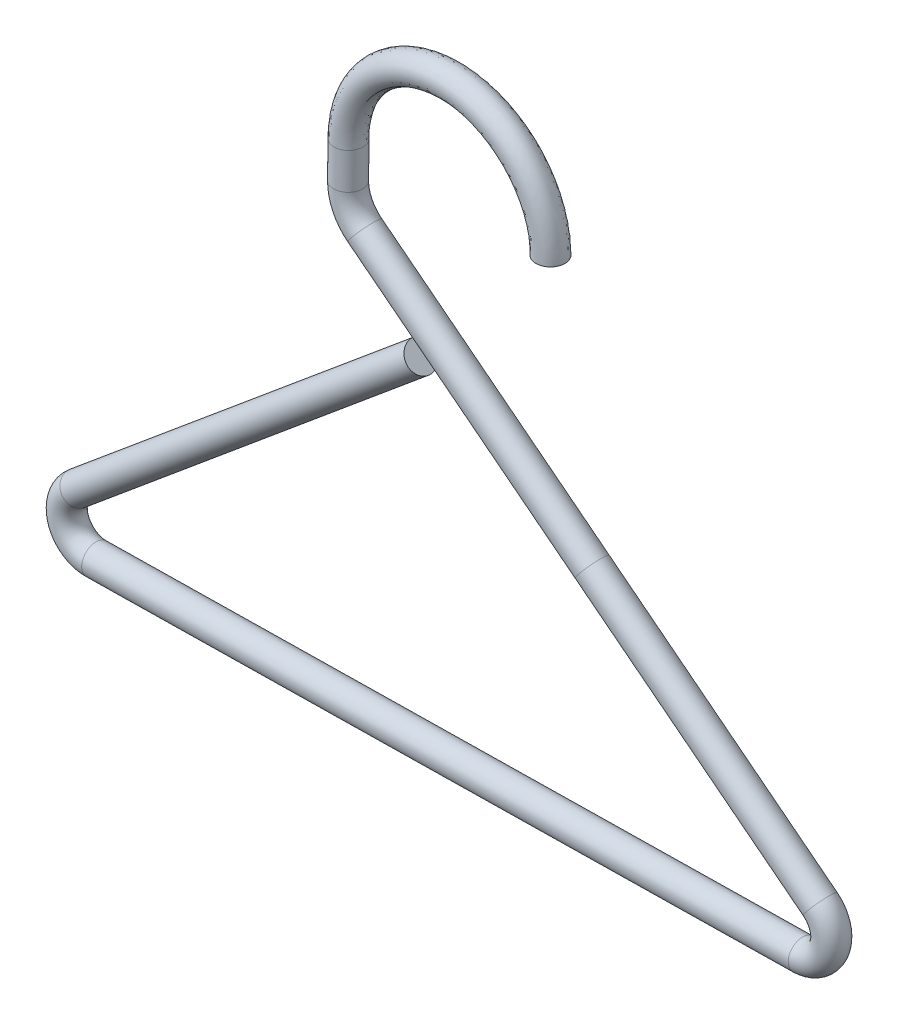
ISO-10303-21;
HEADER;
FILE_DESCRIPTION(('STEP AP214'),'2;1');
FILE_NAME('part.step','',(''),(''),'','','');
FILE_SCHEMA(('AUTOMOTIVE_DESIGN { 1 0 10303 214 1 1 1 1 }'));
ENDSEC;
DATA;
#1=APPLICATION_CONTEXT('core data for automotive mechanical design processes');
#2=APPLICATION_PROTOCOL_DEFINITION('international standard','automotive_design',2000,#1);
#3=PRODUCT_CONTEXT('',#1,'mechanical');
#4=PRODUCT('Part','Part','',(#3));
#5=PRODUCT_RELATED_PRODUCT_CATEGORY('part','',(#4));
#6=PRODUCT_DEFINITION_FORMATION('','',#4);
#7=PRODUCT_DEFINITION_CONTEXT('part definition',#1,'design');
#8=PRODUCT_DEFINITION('design','',#6,#7);
#9=PRODUCT_DEFINITION_SHAPE('','',#8);
#10=(LENGTH_UNIT() NAMED_UNIT(*) SI_UNIT(.MILLI.,.METRE.));
#11=(NAMED_UNIT(*) PLANE_ANGLE_UNIT() SI_UNIT($,.RADIAN.));
#12=(NAMED_UNIT(*) SI_UNIT($,.STERADIAN.) SOLID_ANGLE_UNIT());
#13=UNCERTAINTY_MEASURE_WITH_UNIT(LENGTH_MEASURE(1.E-05),#10,'distance_accuracy_value','');
#14=(GEOMETRIC_REPRESENTATION_CONTEXT(3) GLOBAL_UNCERTAINTY_ASSIGNED_CONTEXT((#13)) GLOBAL_UNIT_ASSIGNED_CONTEXT((#10,
#11,#12)) REPRESENTATION_CONTEXT('',''));
#15=CARTESIAN_POINT('',(0.,0.,0.));
#16=DIRECTION('',(0.,0.,1.));
#17=DIRECTION('',(1.,0.,0.));
#18=AXIS2_PLACEMENT_3D('',#15,#16,#17);
#19=CARTESIAN_POINT('',(34.7848708234437,166.880762929068,0.));
#20=DIRECTION('',(0.,1.,0.));
#21=DIRECTION('',(-1.,0.,0.));
#22=AXIS2_PLACEMENT_3D('',#19,#20,#21);
#23=PLANE('',#22);
#24=CARTESIAN_POINT('',(34.7848708234437,166.880762929068,0.));
#25=DIRECTION('',(0.,1.,0.));
#26=DIRECTION('',(-1.,0.,0.));
#27=AXIS2_PLACEMENT_3D('',#24,#25,#26);
#28=CIRCLE('',#27,5.);
#29=CARTESIAN_POINT('',(29.7848708234437,166.880762929068,0.));
#30=VERTEX_POINT('',#29);
#31=EDGE_CURVE('E60',#30,#30,#28,.T.);
#32=ORIENTED_EDGE('',*,*,#31,.F.);
#33=EDGE_LOOP('',(#32));
#34=FACE_BOUND('',#33,.T.);
#35=ADVANCED_FACE('F57',(#34),#23,.F.);
#36=CARTESIAN_POINT('',(-9.75362425147519,114.481574235297,0.));
#37=DIRECTION('',(0.768326622468667,0.640057967066961,0.));
#38=DIRECTION('',(-0.640057967066961,0.768326622468667,0.));
#39=AXIS2_PLACEMENT_3D('',#36,#37,#38);
#40=PLANE('',#39);
#41=CARTESIAN_POINT('',(-9.75362425147519,114.481574235297,0.));
#42=DIRECTION('',(0.768326622468667,0.640057967066961,0.));
#43=DIRECTION('',(-0.640057967066961,0.768326622468667,0.));
#44=AXIS2_PLACEMENT_3D('',#41,#42,#43);
#45=CIRCLE('',#44,5.);
#46=CARTESIAN_POINT('',(-12.95391408681,118.32320734764,0.));
#47=VERTEX_POINT('',#46);
#48=EDGE_CURVE('E162',#47,#47,#45,.T.);
#49=ORIENTED_EDGE('',*,*,#48,.T.);
#50=EDGE_LOOP('',(#49));
#51=FACE_BOUND('',#50,.T.);
#52=ADVANCED_FACE('F109',(#51),#40,.T.);
#53=CARTESIAN_POINT('',(-29.7848708234437,166.680762929068,0.));
#54=CARTESIAN_POINT('',(-29.7848708234437,166.747429595733,0.));
#55=CARTESIAN_POINT('',(-29.7848712337079,166.818887619035,0.));
#56=CARTESIAN_POINT('',(-29.7848690718144,167.14494052602,0.));
#57=CARTESIAN_POINT('',(-29.7818792644815,167.368193226743,0.));
#58=CARTESIAN_POINT('',(-29.7699160847641,167.855451148638,0.));
#59=CARTESIAN_POINT('',(-29.760944454568,168.098999599399,0.));
#60=CARTESIAN_POINT('',(-29.7250684327807,168.829192658391,0.));
#61=CARTESIAN_POINT('',(-29.6892011832558,169.315385671612,0.));
#62=CARTESIAN_POINT('',(-29.5458803039341,170.770439824601,0.));
#63=CARTESIAN_POINT('',(-29.4026774218284,171.735776002078,0.));
#64=CARTESIAN_POINT('',(-28.8321824746925,174.603717666936,0.));
#65=CARTESIAN_POINT('',(-28.2636414200745,176.477914753748,0.));
#66=CARTESIAN_POINT('',(-26.0256147566677,181.880989077507,0.));
#67=CARTESIAN_POINT('',(-23.8179735227869,185.184957678453,0.));
#68=CARTESIAN_POINT('',(-18.3041947492579,190.698736451729,0.));
#69=CARTESIAN_POINT('',(-15.0002261703578,192.906377676608,0.));
#70=CARTESIAN_POINT('',(-7.7961270281747,195.890413246073,0.));
#71=CARTESIAN_POINT('',(-3.89883036083754,196.665633752449,0.));
#72=CARTESIAN_POINT('',(3.89883036083754,196.665633752575,0.));
#73=CARTESIAN_POINT('',(7.79612702821601,195.890413246145,0.));
#74=CARTESIAN_POINT('',(15.0002261703164,192.906377676536,0.));
#75=CARTESIAN_POINT('',(18.3041947492454,190.698736451931,0.));
#76=CARTESIAN_POINT('',(23.8179735227994,185.184957678251,0.));
#77=CARTESIAN_POINT('',(26.0256147566305,181.880989077584,0.));
#78=CARTESIAN_POINT('',(29.009650307914,174.676889979085,0.));
#79=CARTESIAN_POINT('',(29.7848708234358,170.780296352017,0.));
#80=CARTESIAN_POINT('',(29.7848708234437,166.880762929068,0.));
#81=CARTESIAN_POINT('',(-29.7848708234437,166.680762929068,9.99999999999999));
#82=CARTESIAN_POINT('',(-29.7848708234437,166.747429595733,9.99999999999999));
#83=CARTESIAN_POINT('',(-29.7848712337079,166.818887619035,9.99999999999999));
#84=CARTESIAN_POINT('',(-29.7848690718144,167.14494052602,9.99999999999999));
#85=CARTESIAN_POINT('',(-29.7818792644815,167.368193226743,9.99999999999999));
#86=CARTESIAN_POINT('',(-29.7699160847641,167.855451148638,9.99999999999999));
#87=CARTESIAN_POINT('',(-29.760944454568,168.098999599399,9.99999999999999));
#88=CARTESIAN_POINT('',(-29.7250684327807,168.829192658391,9.99999999999999));
#89=CARTESIAN_POINT('',(-29.6892011832558,169.315385671612,9.99999999999999));
#90=CARTESIAN_POINT('',(-29.5458803039341,170.770439824601,9.99999999999999));
#91=CARTESIAN_POINT('',(-29.4026774218284,171.735776002078,9.99999999999999));
#92=CARTESIAN_POINT('',(-28.8321824746925,174.603717666936,9.99999999999999));
#93=CARTESIAN_POINT('',(-28.2636414200745,176.477914753748,9.99999999999999));
#94=CARTESIAN_POINT('',(-26.0256147566677,181.880989077507,9.99999999999999));
#95=CARTESIAN_POINT('',(-23.8179735227869,185.184957678453,9.99999999999999));
#96=CARTESIAN_POINT('',(-18.3041947492579,190.698736451729,9.99999999999999));
#97=CARTESIAN_POINT('',(-15.0002261703578,192.906377676609,9.99999999999999));
#98=CARTESIAN_POINT('',(-7.7961270281747,195.890413246073,9.99999999999999));
#99=CARTESIAN_POINT('',(-3.89883036083754,196.665633752449,9.99999999999999));
#100=CARTESIAN_POINT('',(3.89883036083754,196.665633752575,9.99999999999999));
#101=CARTESIAN_POINT('',(7.79612702821601,195.890413246145,9.99999999999999));
#102=CARTESIAN_POINT('',(15.0002261703164,192.906377676536,9.99999999999999));
#103=CARTESIAN_POINT('',(18.3041947492454,190.698736451931,9.99999999999999));
#104=CARTESIAN_POINT('',(23.8179735227994,185.184957678251,9.99999999999999));
#105=CARTESIAN_POINT('',(26.0256147566305,181.880989077584,9.99999999999999));
#106=CARTESIAN_POINT('',(29.009650307914,174.676889979085,9.99999999999999));
#107=CARTESIAN_POINT('',(29.7848708234358,170.780296352017,9.99999999999999));
#108=CARTESIAN_POINT('',(29.7848708234437,166.880762929068,9.99999999999999));
#109=CARTESIAN_POINT('',(-39.7848708234437,166.680762929068,9.99999999999999));
#110=CARTESIAN_POINT('',(-39.7848708234437,166.747429595733,9.99999999999999));
#111=CARTESIAN_POINT('',(-39.7848713714504,166.809304909456,9.99999999999999));
#112=CARTESIAN_POINT('',(-39.7848684837202,167.185854053364,9.99999999999999));
#113=CARTESIAN_POINT('',(-39.7808748757155,167.531843524427,9.99999999999999));
#114=CARTESIAN_POINT('',(-39.7648951670085,168.182693870404,9.99999999999999));
#115=CARTESIAN_POINT('',(-39.7529113934152,168.508011502639,9.99999999999999));
#116=CARTESIAN_POINT('',(-39.7049903229852,169.483360252699,9.99999999999999));
#117=CARTESIAN_POINT('',(-39.6570809700247,170.13278815658,9.99999999999999));
#118=CARTESIAN_POINT('',(-39.4656414065018,172.076363532837,9.99999999999999));
#119=CARTESIAN_POINT('',(-39.274359456674,173.365802568857,9.99999999999999));
#120=CARTESIAN_POINT('',(-38.5123260098656,177.196629613275,9.99999999999999));
#121=CARTESIAN_POINT('',(-37.7529024572065,179.70007135853,9.99999999999999));
#122=CARTESIAN_POINT('',(-34.7634786577422,186.917178838896,9.99999999999999));
#123=CARTESIAN_POINT('',(-31.814641919999,191.330424904971,9.99999999999999));
#124=CARTESIAN_POINT('',(-24.4496619757766,198.695404848941,9.99999999999999));
#125=CARTESIAN_POINT('',(-20.0364159391368,201.644241574683,9.99999999999999));
#126=CARTESIAN_POINT('',(-10.4136059066975,205.630139998224,9.99999999999999));
#127=CARTESIAN_POINT('',(-5.20782726193153,206.665633752449,9.99999999999999));
#128=CARTESIAN_POINT('',(5.20782726193153,206.665633752575,9.99999999999999));
#129=CARTESIAN_POINT('',(10.4136059067315,205.630139998236,9.99999999999999));
#130=CARTESIAN_POINT('',(20.0364159391028,201.644241574671,9.99999999999999));
#131=CARTESIAN_POINT('',(24.4496619757599,198.695404849147,9.99999999999999));
#132=CARTESIAN_POINT('',(31.8146419200158,191.330424904765,9.99999999999999));
#133=CARTESIAN_POINT('',(34.7634786577031,186.917178838977,9.99999999999999));
#134=CARTESIAN_POINT('',(38.7493770570671,177.294368864994,9.99999999999999));
#135=CARTESIAN_POINT('',(39.7848708233963,172.089529299981,9.99999999999999));
#136=CARTESIAN_POINT('',(39.7848708234437,166.880762929068,9.99999999999999));
#137=CARTESIAN_POINT('',(-39.7848708234437,166.680762929068,0.));
#138=CARTESIAN_POINT('',(-39.7848708234437,166.747429595733,0.));
#139=CARTESIAN_POINT('',(-39.7848713714504,166.809304909456,0.));
#140=CARTESIAN_POINT('',(-39.7848684837202,167.185854053364,0.));
#141=CARTESIAN_POINT('',(-39.7808748757155,167.531843524427,0.));
#142=CARTESIAN_POINT('',(-39.7648951670085,168.182693870404,0.));
#143=CARTESIAN_POINT('',(-39.7529113934152,168.508011502639,0.));
#144=CARTESIAN_POINT('',(-39.7049903229852,169.483360252699,0.));
#145=CARTESIAN_POINT('',(-39.6570809700247,170.13278815658,0.));
#146=CARTESIAN_POINT('',(-39.4656414065018,172.076363532837,0.));
#147=CARTESIAN_POINT('',(-39.274359456674,173.365802568857,0.));
#148=CARTESIAN_POINT('',(-38.5123260098656,177.196629613275,0.));
#149=CARTESIAN_POINT('',(-37.7529024572065,179.70007135853,0.));
#150=CARTESIAN_POINT('',(-34.7634786577422,186.917178838896,0.));
#151=CARTESIAN_POINT('',(-31.814641919999,191.330424904971,0.));
#152=CARTESIAN_POINT('',(-24.4496619757766,198.695404848941,0.));
#153=CARTESIAN_POINT('',(-20.0364159391368,201.644241574683,0.));
#154=CARTESIAN_POINT('',(-10.4136059066975,205.630139998224,0.));
#155=CARTESIAN_POINT('',(-5.20782726193153,206.665633752449,0.));
#156=CARTESIAN_POINT('',(5.20782726193153,206.665633752575,0.));
#157=CARTESIAN_POINT('',(10.4136059067315,205.630139998236,0.));
#158=CARTESIAN_POINT('',(20.0364159391028,201.644241574671,0.));
#159=CARTESIAN_POINT('',(24.4496619757599,198.695404849147,0.));
#160=CARTESIAN_POINT('',(31.8146419200158,191.330424904765,0.));
#161=CARTESIAN_POINT('',(34.7634786577031,186.917178838977,0.));
#162=CARTESIAN_POINT('',(38.7493770570671,177.294368864994,0.));
#163=CARTESIAN_POINT('',(39.7848708233963,172.089529299981,0.));
#164=CARTESIAN_POINT('',(39.7848708234437,166.880762929068,0.));
#165=CARTESIAN_POINT('',(-39.7848708234437,166.680762929068,-9.99999999999999));
#166=CARTESIAN_POINT('',(-39.7848708234437,166.747429595733,-9.99999999999999));
#167=CARTESIAN_POINT('',(-39.7848713714504,166.809304909456,-9.99999999999999));
#168=CARTESIAN_POINT('',(-39.7848684837202,167.185854053364,-9.99999999999999));
#169=CARTESIAN_POINT('',(-39.7808748757155,167.531843524427,-9.99999999999999));
#170=CARTESIAN_POINT('',(-39.7648951670085,168.182693870404,-9.99999999999999));
#171=CARTESIAN_POINT('',(-39.7529113934152,168.508011502639,-9.99999999999999));
#172=CARTESIAN_POINT('',(-39.7049903229852,169.483360252699,-9.99999999999999));
#173=CARTESIAN_POINT('',(-39.6570809700247,170.13278815658,-9.99999999999999));
#174=CARTESIAN_POINT('',(-39.4656414065018,172.076363532837,-9.99999999999999));
#175=CARTESIAN_POINT('',(-39.274359456674,173.365802568857,-9.99999999999999));
#176=CARTESIAN_POINT('',(-38.5123260098656,177.196629613275,-9.99999999999999));
#177=CARTESIAN_POINT('',(-37.7529024572065,179.70007135853,-9.99999999999999));
#178=CARTESIAN_POINT('',(-34.7634786577422,186.917178838896,-9.99999999999999));
#179=CARTESIAN_POINT('',(-31.814641919999,191.330424904971,-9.99999999999999));
#180=CARTESIAN_POINT('',(-24.4496619757766,198.695404848941,-9.99999999999999));
#181=CARTESIAN_POINT('',(-20.0364159391368,201.644241574683,-9.99999999999999));
#182=CARTESIAN_POINT('',(-10.4136059066975,205.630139998224,-9.99999999999999));
#183=CARTESIAN_POINT('',(-5.20782726193153,206.665633752449,-9.99999999999999));
#184=CARTESIAN_POINT('',(5.20782726193153,206.665633752575,-9.99999999999999));
#185=CARTESIAN_POINT('',(10.4136059067315,205.630139998236,-9.99999999999999));
#186=CARTESIAN_POINT('',(20.0364159391028,201.644241574671,-9.99999999999999));
#187=CARTESIAN_POINT('',(24.4496619757599,198.695404849147,-9.99999999999999));
#188=CARTESIAN_POINT('',(31.8146419200158,191.330424904765,-9.99999999999999));
#189=CARTESIAN_POINT('',(34.7634786577031,186.917178838977,-9.99999999999999));
#190=CARTESIAN_POINT('',(38.7493770570671,177.294368864994,-9.99999999999999));
#191=CARTESIAN_POINT('',(39.7848708233963,172.089529299981,-9.99999999999999));
#192=CARTESIAN_POINT('',(39.7848708234437,166.880762929068,-9.99999999999999));
#193=CARTESIAN_POINT('',(-29.7848708234437,166.680762929068,-9.99999999999999));
#194=CARTESIAN_POINT('',(-29.7848708234437,166.747429595733,-9.99999999999999));
#195=CARTESIAN_POINT('',(-29.7848712337079,166.818887619035,-9.99999999999999));
#196=CARTESIAN_POINT('',(-29.7848690718144,167.14494052602,-9.99999999999999));
#197=CARTESIAN_POINT('',(-29.7818792644815,167.368193226743,-9.99999999999999));
#198=CARTESIAN_POINT('',(-29.7699160847641,167.855451148638,-9.99999999999999));
#199=CARTESIAN_POINT('',(-29.760944454568,168.098999599399,-9.99999999999999));
#200=CARTESIAN_POINT('',(-29.7250684327807,168.829192658391,-9.99999999999999));
#201=CARTESIAN_POINT('',(-29.6892011832558,169.315385671612,-9.99999999999999));
#202=CARTESIAN_POINT('',(-29.5458803039341,170.770439824601,-9.99999999999999));
#203=CARTESIAN_POINT('',(-29.4026774218284,171.735776002078,-9.99999999999999));
#204=CARTESIAN_POINT('',(-28.8321824746925,174.603717666936,-9.99999999999999));
#205=CARTESIAN_POINT('',(-28.2636414200745,176.477914753748,-9.99999999999999));
#206=CARTESIAN_POINT('',(-26.0256147566677,181.880989077507,-9.99999999999999));
#207=CARTESIAN_POINT('',(-23.8179735227869,185.184957678453,-9.99999999999999));
#208=CARTESIAN_POINT('',(-18.3041947492579,190.698736451729,-9.99999999999999));
#209=CARTESIAN_POINT('',(-15.0002261703578,192.906377676609,-9.99999999999999));
#210=CARTESIAN_POINT('',(-7.7961270281747,195.890413246073,-9.99999999999999));
#211=CARTESIAN_POINT('',(-3.89883036083754,196.665633752449,-9.99999999999999));
#212=CARTESIAN_POINT('',(3.89883036083754,196.665633752575,-9.99999999999999));
#213=CARTESIAN_POINT('',(7.79612702821601,195.890413246145,-9.99999999999999));
#214=CARTESIAN_POINT('',(15.0002261703164,192.906377676536,-9.99999999999999));
#215=CARTESIAN_POINT('',(18.3041947492454,190.698736451931,-9.99999999999999));
#216=CARTESIAN_POINT('',(23.8179735227994,185.184957678251,-9.99999999999999));
#217=CARTESIAN_POINT('',(26.0256147566305,181.880989077584,-9.99999999999999));
#218=CARTESIAN_POINT('',(29.009650307914,174.676889979085,-9.99999999999999));
#219=CARTESIAN_POINT('',(29.7848708234358,170.780296352017,-9.99999999999999));
#220=CARTESIAN_POINT('',(29.7848708234437,166.880762929068,-9.99999999999999));
#221=CARTESIAN_POINT('',(-29.7848708234437,166.680762929068,0.));
#222=CARTESIAN_POINT('',(-29.7848708234437,166.747429595733,0.));
#223=CARTESIAN_POINT('',(-29.7848712337079,166.818887619035,0.));
#224=CARTESIAN_POINT('',(-29.7848690718144,167.14494052602,0.));
#225=CARTESIAN_POINT('',(-29.7818792644815,167.368193226743,0.));
#226=CARTESIAN_POINT('',(-29.7699160847641,167.855451148638,0.));
#227=CARTESIAN_POINT('',(-29.760944454568,168.098999599399,0.));
#228=CARTESIAN_POINT('',(-29.7250684327807,168.829192658391,0.));
#229=CARTESIAN_POINT('',(-29.6892011832558,169.315385671612,0.));
#230=CARTESIAN_POINT('',(-29.5458803039341,170.770439824601,0.));
#231=CARTESIAN_POINT('',(-29.4026774218284,171.735776002078,0.));
#232=CARTESIAN_POINT('',(-28.8321824746925,174.603717666936,0.));
#233=CARTESIAN_POINT('',(-28.2636414200745,176.477914753748,0.));
#234=CARTESIAN_POINT('',(-26.0256147566677,181.880989077507,0.));
#235=CARTESIAN_POINT('',(-23.8179735227869,185.184957678453,0.));
#236=CARTESIAN_POINT('',(-18.3041947492579,190.698736451729,0.));
#237=CARTESIAN_POINT('',(-15.0002261703578,192.906377676608,0.));
#238=CARTESIAN_POINT('',(-7.7961270281747,195.890413246073,0.));
#239=CARTESIAN_POINT('',(-3.89883036083754,196.665633752449,0.));
#240=CARTESIAN_POINT('',(3.89883036083754,196.665633752575,0.));
#241=CARTESIAN_POINT('',(7.79612702821601,195.890413246145,0.));
#242=CARTESIAN_POINT('',(15.0002261703164,192.906377676536,0.));
#243=CARTESIAN_POINT('',(18.3041947492454,190.698736451931,0.));
#244=CARTESIAN_POINT('',(23.8179735227994,185.184957678251,0.));
#245=CARTESIAN_POINT('',(26.0256147566305,181.880989077584,0.));
#246=CARTESIAN_POINT('',(29.009650307914,174.676889979085,0.));
#247=CARTESIAN_POINT('',(29.7848708234358,170.780296352017,0.));
#248=CARTESIAN_POINT('',(29.7848708234437,166.880762929068,0.));
#249=(BOUNDED_SURFACE() B_SPLINE_SURFACE(3,3,((#53,#54,#55,#56,#57,#58,#59,#60,#61,#62,#63,#64,
#65,#66,#67,#68,#69,#70,#71,#72,#73,#74,#75,#76,#77,#78,#79,#80),(#81,#82,#83,#84,#85,#86,#87,
#88,#89,#90,#91,#92,#93,#94,#95,#96,#97,#98,#99,#100,#101,#102,#103,#104,#105,#106,#107,#108),
(#109,#110,#111,#112,#113,#114,#115,#116,#117,#118,#119,#120,#121,#122,#123,#124,#125,#126,#127,
#128,#129,#130,#131,#132,#133,#134,#135,#136),(#137,#138,#139,#140,#141,#142,#143,#144,#145,
#146,#147,#148,#149,#150,#151,#152,#153,#154,#155,#156,#157,#158,#159,#160,#161,#162,#163,#164),
(#165,#166,#167,#168,#169,#170,#171,#172,#173,#174,#175,#176,#177,#178,#179,#180,#181,#182,#183,
#184,#185,#186,#187,#188,#189,#190,#191,#192),(#193,#194,#195,#196,#197,#198,#199,#200,#201,
#202,#203,#204,#205,#206,#207,#208,#209,#210,#211,#212,#213,#214,#215,#216,#217,#218,#219,#220),
(#221,#222,#223,#224,#225,#226,#227,#228,#229,#230,#231,#232,#233,#234,#235,#236,#237,#238,#239,
#240,#241,#242,#243,#244,#245,#246,#247,#248)),.UNSPECIFIED.,.T.,.F.,
.F.) B_SPLINE_SURFACE_WITH_KNOTS((4,3,4),(4,2,2,2,2,2,2,2,2,2,2,2,2,4),(0.,0.5,1.),
(-0.00182983290487914,0.,0.0078125,0.015625,0.03125,0.0625,0.125,0.25,0.375,0.5,0.625,0.75,
0.875,1.),.UNSPECIFIED.) GEOMETRIC_REPRESENTATION_ITEM() RATIONAL_B_SPLINE_SURFACE(((1.,1.,1.,
1.,1.,1.,1.,1.,1.,1.,1.,1.,1.,1.,1.,1.,1.,1.,1.,1.,1.,1.,1.,1.,1.,1.,1.,1.),(0.333333333333333,
0.333333333333333,0.333333333333333,0.333333333333333,0.333333333333333,0.333333333333333,
0.333333333333333,0.333333333333333,0.333333333333333,0.333333333333333,0.333333333333333,
0.333333333333333,0.333333333333333,0.333333333333333,0.333333333333333,0.333333333333333,
0.333333333333333,0.333333333333333,0.333333333333333,0.333333333333333,0.333333333333333,
0.333333333333333,0.333333333333333,0.333333333333333,0.333333333333333,0.333333333333333,
0.333333333333333,0.333333333333333),(0.333333333333333,0.333333333333333,0.333333333333333,
0.333333333333333,0.333333333333333,0.333333333333333,0.333333333333333,0.333333333333333,
0.333333333333333,0.333333333333333,0.333333333333333,0.333333333333333,0.333333333333333,
0.333333333333333,0.333333333333333,0.333333333333333,0.333333333333333,0.333333333333333,
0.333333333333333,0.333333333333333,0.333333333333333,0.333333333333333,0.333333333333333,
0.333333333333333,0.333333333333333,0.333333333333333,0.333333333333333,0.333333333333333),(1.,
1.,1.,1.,1.,1.,1.,1.,1.,1.,1.,1.,1.,1.,1.,1.,1.,1.,1.,1.,1.,1.,1.,1.,1.,1.,1.,1.),
(0.333333333333333,0.333333333333333,0.333333333333333,0.333333333333333,0.333333333333333,
0.333333333333333,0.333333333333333,0.333333333333333,0.333333333333333,0.333333333333333,
0.333333333333333,0.333333333333333,0.333333333333333,0.333333333333333,0.333333333333333,
0.333333333333333,0.333333333333333,0.333333333333333,0.333333333333333,0.333333333333333,
0.333333333333333,0.333333333333333,0.333333333333333,0.333333333333333,0.333333333333333,
0.333333333333333,0.333333333333333,0.333333333333333),(0.333333333333333,0.333333333333333,
0.333333333333333,0.333333333333333,0.333333333333333,0.333333333333333,0.333333333333333,
0.333333333333333,0.333333333333333,0.333333333333333,0.333333333333333,0.333333333333333,
0.333333333333333,0.333333333333333,0.333333333333333,0.333333333333333,0.333333333333333,
0.333333333333333,0.333333333333333,0.333333333333333,0.333333333333333,0.333333333333333,
0.333333333333333,0.333333333333333,0.333333333333333,0.333333333333333,0.333333333333333,
0.333333333333333),(1.,1.,1.,1.,1.,1.,1.,1.,1.,1.,1.,1.,1.,1.,1.,1.,1.,1.,1.,1.,1.,1.,1.,1.,1.,
1.,1.,1.))) REPRESENTATION_ITEM('') SURFACE());
#250=CARTESIAN_POINT('',(-34.7848708234479,166.880762929068,-5.));
#251=CARTESIAN_POINT('',(-34.7404586734684,166.880512426213,-5.00000099030725));
#252=CARTESIAN_POINT('',(-34.6960408798931,166.880261893046,-4.99940881448281));
#253=CARTESIAN_POINT('',(-34.5113375626816,166.879220102711,-4.99448276241626));
#254=CARTESIAN_POINT('',(-34.3711576584473,166.878429454842,-4.98483035624724));
#255=CARTESIAN_POINT('',(-34.0920794972582,166.876855417655,-4.95376349437827));
#256=CARTESIAN_POINT('',(-33.9531817252759,166.876072031082,-4.93234475959366));
#257=CARTESIAN_POINT('',(-33.6774011919902,166.874516651508,-4.87783684728203));
#258=CARTESIAN_POINT('',(-33.5405228388762,166.873744683424,-4.84472521723319));
#259=CARTESIAN_POINT('',(-33.2699697308538,166.872218842436,-4.76706670879121));
#260=CARTESIAN_POINT('',(-33.1362976091407,166.871464984404,-4.72251076088781));
#261=CARTESIAN_POINT('',(-32.7421376803693,166.869242116629,-4.57231366212615));
#262=CARTESIAN_POINT('',(-32.4877909983626,166.867807778934,-4.45000106441216));
#263=CARTESIAN_POINT('',(-32.003271250808,166.865075508651,-4.16434823540868));
#264=CARTESIAN_POINT('',(-31.7730992081488,166.863777581834,-4.0010062690563));
#265=CARTESIAN_POINT('',(-31.4509728877664,166.861961176126,-3.72893767645263));
#266=CARTESIAN_POINT('',(-31.3473936803132,166.861377121982,-3.63366899668897));
#267=CARTESIAN_POINT('',(-31.1486992618823,166.860256753028,-3.43481676907297));
#268=CARTESIAN_POINT('',(-31.0535759814848,166.859720392704,-3.33124133185019));
#269=CARTESIAN_POINT('',(-30.8723520974443,166.858698557868,-3.11640247670063));
#270=CARTESIAN_POINT('',(-30.7862558651985,166.858213108011,-3.00513537692432));
#271=CARTESIAN_POINT('',(-30.6237213568761,166.857296672643,-2.77571582951562));
#272=CARTESIAN_POINT('',(-30.5472853236484,166.856865699781,-2.65756179218453));
#273=CARTESIAN_POINT('',(-30.4046669950254,166.856061574452,-2.41527793352418));
#274=CARTESIAN_POINT('',(-30.3384809770894,166.855688400994,-2.29115030321816));
#275=CARTESIAN_POINT('',(-30.2167764702348,166.855002204707,-2.03771445492267));
#276=CARTESIAN_POINT('',(-30.1612619184467,166.854689204079,-1.9084043460917));
#277=CARTESIAN_POINT('',(-30.0613450419487,166.854125858336,-1.64561709010098));
#278=CARTESIAN_POINT('',(-30.0169384375993,166.853875489092,-1.51214157014176));
#279=CARTESIAN_POINT('',(-29.9395108356462,166.853438945514,-1.24187454160851));
#280=CARTESIAN_POINT('',(-29.9064940468694,166.853252794912,-1.10508182718856));
#281=CARTESIAN_POINT('',(-29.8521138555514,166.85294619692,-0.829252553322972));
#282=CARTESIAN_POINT('',(-29.8307460975739,166.852825724974,-0.690216852549995));
#283=CARTESIAN_POINT('',(-29.7997912095235,166.852651200739,-0.410788068914753));
#284=CARTESIAN_POINT('',(-29.7902084312067,166.852597172984,-0.270394503918811));
#285=CARTESIAN_POINT('',(-29.782907437789,166.852556009934,0.0106489435674225));
#286=CARTESIAN_POINT('',(-29.7851848524351,166.852568849999,0.15129871255666));
#287=CARTESIAN_POINT('',(-29.8015809909303,166.852661291583,0.431958363284511));
#288=CARTESIAN_POINT('',(-29.8157040725352,166.852740917672,0.571967990468231));
#289=CARTESIAN_POINT('',(-29.8556893299015,166.85296635564,0.850247467693089));
#290=CARTESIAN_POINT('',(-29.8815471337848,166.853112142871,0.988517945971147));
#291=CARTESIAN_POINT('',(-29.9448277766209,166.853468922917,1.26243730447437));
#292=CARTESIAN_POINT('',(-29.98225463383,166.853679938387,1.39808525640191));
#293=CARTESIAN_POINT('',(-30.0683974317319,166.854165620725,1.66572423837927));
#294=CARTESIAN_POINT('',(-30.1171115951582,166.854440277571,1.79771584048804));
#295=CARTESIAN_POINT('',(-30.2254858695126,166.855051310138,2.05712599141435));
#296=CARTESIAN_POINT('',(-30.2851459807946,166.85538768586,2.18454454008397));
#297=CARTESIAN_POINT('',(-30.4150025872373,166.856119849548,2.43393077177389));
#298=CARTESIAN_POINT('',(-30.4852014463457,166.856515650844,2.55589722384761));
#299=CARTESIAN_POINT('',(-30.635600149086,166.857363649907,2.79343992448627));
#300=CARTESIAN_POINT('',(-30.7157965074216,166.857815828021,2.9090183798455));
#301=CARTESIAN_POINT('',(-30.8856604788423,166.858773597199,3.13303721855996));
#302=CARTESIAN_POINT('',(-30.9753304346503,166.859279201476,3.24147582549238));
#303=CARTESIAN_POINT('',(-31.1634528383098,166.860339942952,3.45037401862441));
#304=CARTESIAN_POINT('',(-31.2619020420547,166.860895061854,3.550836526424));
#305=CARTESIAN_POINT('',(-31.4669292703339,166.862051150489,3.74312967265596));
#306=CARTESIAN_POINT('',(-31.5735086942547,166.862652128116,3.83495881900041));
#307=CARTESIAN_POINT('',(-31.7939830779661,166.863895352064,4.00928072712547));
#308=CARTESIAN_POINT('',(-31.9078753257837,166.864537583086,4.09177691905691));
#309=CARTESIAN_POINT('',(-32.1423105887125,166.865859568968,4.24695814958128));
#310=CARTESIAN_POINT('',(-32.2628596797498,166.866539358109,4.31963400913558));
#311=CARTESIAN_POINT('',(-32.5096084615146,166.867930823787,4.45454204138207));
#312=CARTESIAN_POINT('',(-32.6358060512672,166.868642488468,4.51677805697515));
#313=CARTESIAN_POINT('',(-32.8931626485886,166.870093821983,4.63047032108449));
#314=CARTESIAN_POINT('',(-33.0243278814596,166.870833525956,4.68191247732997));
#315=CARTESIAN_POINT('',(-33.290481135659,166.872334519687,4.77353107753175));
#316=CARTESIAN_POINT('',(-33.4254677002656,166.873095801221,4.81371175244157));
#317=CARTESIAN_POINT('',(-33.6980757369867,166.874633253035,4.88247894000836));
#318=CARTESIAN_POINT('',(-33.8356914925042,166.875409391019,4.9110881443049));
#319=CARTESIAN_POINT('',(-34.1127863266288,166.876972205591,4.95661186176281));
#320=CARTESIAN_POINT('',(-34.252264443988,166.877758876743,4.97353218702429));
#321=CARTESIAN_POINT('',(-34.4785365061438,166.879035099176,4.99135919840316));
#322=CARTESIAN_POINT('',(-34.5650576560809,166.879523102537,4.9959165706195));
#323=CARTESIAN_POINT('',(-34.6960371250381,166.88026187187,4.99940815579784));
#324=CARTESIAN_POINT('',(-34.7404541446485,166.880512400673,5.0000001414844));
#325=CARTESIAN_POINT('',(-34.7848708234436,166.880762929067,5.));
#326=B_SPLINE_CURVE_WITH_KNOTS('',3,(#250,#251,#252,#253,#254,#255,#256,#257,#258,#259,#260,
#261,#262,#263,#264,#265,#266,#267,#268,#269,#270,#271,#272,#273,#274,#275,#276,#277,#278,#279,
#280,#281,#282,#283,#284,#285,#286,#287,#288,#289,#290,#291,#292,#293,#294,#295,#296,#297,#298,
#299,#300,#301,#302,#303,#304,#305,#306,#307,#308,#309,#310,#311,#312,#313,#314,#315,#316,#317,
#318,#319,#320,#321,#322,#323,#324,#325),.UNSPECIFIED.,.F.,.F.,(4,2,2,2,2,2,2,2,2,2,2,2,2,2,2,2,
2,2,2,2,2,2,2,2,2,2,2,2,2,2,2,2,2,2,2,2,2,4),(0.,0.133249926789377,0.554242318326402,
0.975387914475232,1.39734662509604,1.81964077121291,2.66206901360895,3.50453288687602,
3.926306771264,4.3476737398691,4.7692438243393,5.19091160738545,5.61242589063316,
6.03409539012035,6.45560217883775,6.87726455861852,7.29876917545388,7.72042939162958,
8.14193424511989,8.5635942288568,8.98509724811264,9.4067468319914,9.82833006921337,
10.2499133200707,10.6715912780045,11.093122640868,11.5147584891679,11.9362391751805,
12.3577925715269,12.7791905270791,13.200979677122,13.6226132244765,14.0447938701947,
14.4668156888096,14.8880058632718,15.3089864569115,15.5688020392834,15.7020519660737),.UNSPECIFIED.);
#327=CARTESIAN_POINT('',(-34.7848708234479,166.880762929068,-5.));
#328=VERTEX_POINT('',#327);
#329=CARTESIAN_POINT('',(-34.7848708234436,166.880762929067,5.));
#330=VERTEX_POINT('',#329);
#331=EDGE_CURVE('E12',#328,#330,#326,.T.);
#332=CARTESIAN_POINT('',(-34.7848708234479,166.880762929068,-5.));
#333=CARTESIAN_POINT('',(-34.8292829734305,166.881013430677,-5.00000099030676));
#334=CARTESIAN_POINT('',(-34.8737007656467,166.881264206134,-4.99940881448188));
#335=CARTESIAN_POINT('',(-35.0584038350323,166.882308014467,-4.99448276826979));
#336=CARTESIAN_POINT('',(-35.1985834807748,166.883102622403,-4.98483038690653));
#337=CARTESIAN_POINT('',(-35.4776611019668,166.88468941578,-4.9537636052474));
#338=CARTESIAN_POINT('',(-35.616558592439,166.885481600235,-4.93234492590776));
#339=CARTESIAN_POINT('',(-35.8923385405848,166.887059261944,-4.87783714862959));
#340=CARTESIAN_POINT('',(-36.0292165900563,166.887844723297,-4.84472559834618));
#341=CARTESIAN_POINT('',(-36.2997690730711,166.889401914463,-4.76706726764983));
#342=CARTESIAN_POINT('',(-36.4334408734019,166.890173632864,-4.72251141772956));
#343=CARTESIAN_POINT('',(-36.827599830359,166.892455912216,-4.57231462686364));
#344=CARTESIAN_POINT('',(-37.0819458375,166.893937692568,-4.4500022564415));
#345=CARTESIAN_POINT('',(-37.5664641937662,166.896775511859,-4.16434991526281));
#346=CARTESIAN_POINT('',(-37.7966355200194,166.898131545477,-4.00100820947604));
#347=CARTESIAN_POINT('',(-38.1187606920242,166.900038151773,-3.72894010861834));
#348=CARTESIAN_POINT('',(-38.2223394703842,166.90065279993,-3.63367164966672));
#349=CARTESIAN_POINT('',(-38.4210330549199,166.901834475822,-3.43481988941779));
#350=CARTESIAN_POINT('',(-38.5161559304969,166.902401548926,-3.33124469872964));
#351=CARTESIAN_POINT('',(-38.6973790410361,166.903484075287,-3.11640636307494));
#352=CARTESIAN_POINT('',(-38.7834749045946,166.903999503528,-3.00513953625138));
#353=CARTESIAN_POINT('',(-38.9460087251305,166.904974278475,-2.77572056124921));
#354=CARTESIAN_POINT('',(-39.0224444392606,166.905433612155,-2.65756682337098));
#355=CARTESIAN_POINT('',(-39.1650622708584,166.90629199003,-2.41528345723321));
#356=CARTESIAN_POINT('',(-39.2312480997846,166.906691056046,-2.29115601347859));
#357=CARTESIAN_POINT('',(-39.3529522828478,166.907425823559,-2.0377205497027));
#358=CARTESIAN_POINT('',(-39.4084666998764,166.907761501669,-1.90841063884498));
#359=CARTESIAN_POINT('',(-39.5083833738855,166.908366296117,-1.64562378582355));
#360=CARTESIAN_POINT('',(-39.5527899103496,166.908635438088,-1.5121484708074));
#361=CARTESIAN_POINT('',(-39.6302174530532,166.909105079701,-1.24188185620932));
#362=CARTESIAN_POINT('',(-39.6632342504868,166.909305553969,-1.10508935078088));
#363=CARTESIAN_POINT('',(-39.7176146055857,166.909635911196,-0.829260178226872));
#364=CARTESIAN_POINT('',(-39.7389824921792,166.90976582038,-0.690224364555131));
#365=CARTESIAN_POINT('',(-39.7699376729596,166.90995405929,-0.410795341138524));
#366=CARTESIAN_POINT('',(-39.7795206153985,166.910012362576,-0.270401649254307));
#367=CARTESIAN_POINT('',(-39.7868219736111,166.91005678217,0.0106420690490569));
#368=CARTESIAN_POINT('',(-39.7845447595141,166.910042925068,0.151291981964196));
#369=CARTESIAN_POINT('',(-39.7681490565705,166.909943188449,0.431951938125606));
#370=CARTESIAN_POINT('',(-39.7540262099793,166.909857282427,0.571961726823337));
#371=CARTESIAN_POINT('',(-39.7140414253994,166.909614211932,0.850241730549803));
#372=CARTESIAN_POINT('',(-39.6881838437092,166.909457073902,0.988512571571199));
#373=CARTESIAN_POINT('',(-39.62490363669,166.909072853931,1.26243266623549));
#374=CARTESIAN_POINT('',(-39.5874769930961,166.908845747687,1.39808099158313));
#375=CARTESIAN_POINT('',(-39.50133460527,166.908323629387,1.66572072551238));
#376=CARTESIAN_POINT('',(-39.4526206383105,166.908028628021,1.79771270615324));
#377=CARTESIAN_POINT('',(-39.344246730483,166.907373255152,2.05712361204543));
#378=CARTESIAN_POINT('',(-39.284586789283,166.907012883648,2.1845425371581));
#379=CARTESIAN_POINT('',(-39.1547305435596,166.90622978265,2.43392940295047));
#380=CARTESIAN_POINT('',(-39.0845318842071,166.905807039222,2.55589611743362));
#381=CARTESIAN_POINT('',(-38.9341335536379,166.904903019319,2.79343933330914));
#382=CARTESIAN_POINT('',(-38.8539373677567,166.904421763245,2.90901804151782));
#383=CARTESIAN_POINT('',(-38.6840737064978,166.90340453914,3.1330373662064));
#384=CARTESIAN_POINT('',(-38.5944038885067,166.902868557578,3.24147620634875));
#385=CARTESIAN_POINT('',(-38.4062817185747,166.901746666413,3.45037483755763));
#386=CARTESIAN_POINT('',(-38.3078326107916,166.901160775258,3.55083755026627));
#387=CARTESIAN_POINT('',(-38.1028059122281,166.899943622383,3.74313070907322));
#388=CARTESIAN_POINT('',(-37.9962269523926,166.899312353024,3.83495969542594));
#389=CARTESIAN_POINT('',(-37.7757535017329,166.898009906997,4.00928130943027));
#390=CARTESIAN_POINT('',(-37.6618617229002,166.897338745131,4.09177736724861));
#391=CARTESIAN_POINT('',(-37.4274273967321,166.895961037307,4.24695835364241));
#392=CARTESIAN_POINT('',(-37.3068787735503,166.895254459079,4.31963410332775));
#393=CARTESIAN_POINT('',(-37.0601309177788,166.893812338287,4.45454194190339));
#394=CARTESIAN_POINT('',(-36.933933786162,166.893076806504,4.51677787367483));
#395=CARTESIAN_POINT('',(-36.6765780940061,166.891581268573,4.63046999662861));
#396=CARTESIAN_POINT('',(-36.5454133082535,166.890821231905,4.68191209581959));
#397=CARTESIAN_POINT('',(-36.2792609291809,166.889283681522,4.77353061396536));
#398=CARTESIAN_POINT('',(-36.1442747925853,166.88850617449,4.81371126384861));
#399=CARTESIAN_POINT('',(-35.8716675853747,166.886940801539,4.88247843896328));
#400=CARTESIAN_POINT('',(-35.7340522313487,166.886152959053,4.9110876555484));
#401=CARTESIAN_POINT('',(-35.4569581722553,166.88457148739,4.9566114401162));
#402=CARTESIAN_POINT('',(-35.317480428437,166.883777861287,4.97353182010421));
#403=CARTESIAN_POINT('',(-35.0912075375055,166.882494312953,4.99135907011431));
#404=CARTESIAN_POINT('',(-35.0046851904303,166.882004434344,4.99591653804918));
#405=CARTESIAN_POINT('',(-34.8737045204039,166.881264227952,4.99940815580933));
#406=CARTESIAN_POINT('',(-34.8292875021262,166.881013457082,5.00000014150124));
#407=CARTESIAN_POINT('',(-34.7848708234436,166.880762929067,5.));
#408=B_SPLINE_CURVE_WITH_KNOTS('',3,(#332,#333,#334,#335,#336,#337,#338,#339,#340,#341,#342,
#343,#344,#345,#346,#347,#348,#349,#350,#351,#352,#353,#354,#355,#356,#357,#358,#359,#360,#361,
#362,#363,#364,#365,#366,#367,#368,#369,#370,#371,#372,#373,#374,#375,#376,#377,#378,#379,#380,
#381,#382,#383,#384,#385,#386,#387,#388,#389,#390,#391,#392,#393,#394,#395,#396,#397,#398,#399,
#400,#401,#402,#403,#404,#405,#406,#407),.UNSPECIFIED.,.F.,.F.,(4,2,2,2,2,2,2,2,2,2,2,2,2,2,2,2,
2,2,2,2,2,2,2,2,2,2,2,2,2,2,2,2,2,2,2,2,2,4),(0.,0.133249926792795,0.554241608908285,
0.975386494312501,1.39734448807281,1.81963791718628,2.66206477527871,3.50452726354124,
3.92630014452659,4.34766611046737,4.76923519290863,5.19090197412807,5.61241571203031,
6.03408466590046,6.45559091417565,6.8772527535862,7.29875778947569,7.72041842503771,
8.14192370167709,8.56358410877356,8.98508811029887,9.40673867698926,9.82832289674103,
10.2499071292768,10.6715857035055,11.0931176811986,11.5147541391986,11.9362354329923,
12.3577878609833,12.7791848473806,13.2009730220392,13.622605594781,14.0447852551836,
14.4668060893432,14.8879952891085,15.3089749111939,15.5687941214291,15.7020440482227),.UNSPECIFIED.);
#409=EDGE_CURVE('E66',#328,#330,#408,.T.);
#410=ORIENTED_EDGE('',*,*,#31,.T.);
#411=EDGE_LOOP('',(#410));
#412=FACE_BOUND('',#411,.T.);
#413=ORIENTED_EDGE('',*,*,#331,.F.);
#414=ORIENTED_EDGE('',*,*,#409,.T.);
#415=EDGE_LOOP('',(#413,#414));
#416=FACE_BOUND('',#415,.T.);
#417=ADVANCED_FACE('F76',(#412,#416),#249,.F.);
#418=CARTESIAN_POINT('',(-9.75362425147519,114.481574235297,0.));
#419=DIRECTION('',(-0.768326622468667,-0.64005796706696,0.));
#420=DIRECTION('',(0.640057967066961,-0.768326622468667,0.));
#421=AXIS2_PLACEMENT_3D('',#418,#419,#420);
#422=CYLINDRICAL_SURFACE('',#421,5.);
#423=CARTESIAN_POINT('',(-128.242342258369,15.7740119173504,0.));
#424=DIRECTION('',(0.768326622468667,0.640057967066961,0.));
#425=DIRECTION('',(-0.640057967066961,0.768326622468667,0.));
#426=AXIS2_PLACEMENT_3D('',#423,#424,#425);
#427=CIRCLE('',#426,5.);
#428=CARTESIAN_POINT('',(-131.442632093704,19.6156450296937,0.));
#429=VERTEX_POINT('',#428);
#430=EDGE_CURVE('E160',#429,#429,#427,.T.);
#431=ORIENTED_EDGE('',*,*,#430,.T.);
#432=EDGE_LOOP('',(#431));
#433=FACE_BOUND('',#432,.T.);
#434=ORIENTED_EDGE('',*,*,#48,.F.);
#435=EDGE_LOOP('',(#434));
#436=FACE_BOUND('',#435,.T.);
#437=ADVANCED_FACE('F108',(#433,#436),#422,.T.);
#438=CARTESIAN_POINT('',(-121.8417625877,8.09074569266375,0.));
#439=DIRECTION('',(0.,0.,1.));
#440=DIRECTION('',(1.,0.,0.));
#441=AXIS2_PLACEMENT_3D('',#438,#439,#440);
#442=TOROIDAL_SURFACE('',#441,10.,5.);
#443=CARTESIAN_POINT('',(-121.684981473131,-1.90802521590869,0.));
#444=DIRECTION('',(-0.999877090857244,-0.0156781114568879,0.));
#445=DIRECTION('',(0.0156781114568879,-0.999877090857244,0.));
#446=AXIS2_PLACEMENT_3D('',#443,#444,#445);
#447=CIRCLE('',#446,5.);
#448=CARTESIAN_POINT('',(-121.606590915846,-6.90741067019494,0.));
#449=VERTEX_POINT('',#448);
#450=EDGE_CURVE('E167',#449,#449,#447,.T.);
#451=CARTESIAN_POINT('',(-121.8417625877,8.09074569266375,0.));
#452=DIRECTION('',(0.,0.,1.));
#453=DIRECTION('',(1.,0.,0.));
#454=AXIS2_PLACEMENT_3D('',#451,#452,#453);
#455=CIRCLE('',#454,15.);
#456=EDGE_CURVE('',#429,#449,#455,.T.);
#457=ORIENTED_EDGE('',*,*,#430,.F.);
#458=ORIENTED_EDGE('',*,*,#450,.T.);
#459=ORIENTED_EDGE('',*,*,#456,.T.);
#460=ORIENTED_EDGE('',*,*,#456,.F.);
#461=EDGE_LOOP('',(#457,#459,#458,#460));
#462=FACE_BOUND('',#461,.T.);
#463=ADVANCED_FACE('F148',(#462),#442,.T.);
#464=CARTESIAN_POINT('',(-121.684981473131,-1.9080252159087,0.));
#465=DIRECTION('',(0.999877090857244,0.0156781114568876,0.));
#466=DIRECTION('',(-0.0156781114568876,0.999877090857244,0.));
#467=AXIS2_PLACEMENT_3D('',#464,#465,#466);
#468=CYLINDRICAL_SURFACE('',#467,5.);
#469=CARTESIAN_POINT('',(121.684981473131,1.90802521590869,0.));
#470=DIRECTION('',(-0.999877090857244,-0.0156781114568878,0.));
#471=DIRECTION('',(0.0156781114568878,-0.999877090857244,0.));
#472=AXIS2_PLACEMENT_3D('',#469,#470,#471);
#473=CIRCLE('',#472,5.);
#474=CARTESIAN_POINT('',(121.763372030415,-3.09136023837754,0.));
#475=VERTEX_POINT('',#474);
#476=EDGE_CURVE('E174',#475,#475,#473,.T.);
#477=ORIENTED_EDGE('',*,*,#476,.T.);
#478=EDGE_LOOP('',(#477));
#479=FACE_BOUND('',#478,.T.);
#480=ORIENTED_EDGE('',*,*,#450,.F.);
#481=EDGE_LOOP('',(#480));
#482=FACE_BOUND('',#481,.T.);
#483=ADVANCED_FACE('F144',(#479,#482),#468,.T.);
#484=CARTESIAN_POINT('',(121.528200358562,11.9067961244811,0.));
#485=DIRECTION('',(0.,0.,1.));
#486=DIRECTION('',(1.,0.,0.));
#487=AXIS2_PLACEMENT_3D('',#484,#485,#486);
#488=TOROIDAL_SURFACE('',#487,10.,5.);
#489=CARTESIAN_POINT('',(127.685045282813,19.7867238258453,0.));
#490=DIRECTION('',(0.787992770136417,-0.615684492425086,0.));
#491=DIRECTION('',(0.615684492425086,0.787992770136417,0.));
#492=AXIS2_PLACEMENT_3D('',#489,#490,#491);
#493=CIRCLE('',#492,5.);
#494=CARTESIAN_POINT('',(130.763467744938,23.7266876765274,0.));
#495=VERTEX_POINT('',#494);
#496=EDGE_CURVE('E178',#495,#495,#493,.T.);
#497=CARTESIAN_POINT('',(121.528200358562,11.9067961244811,0.));
#498=DIRECTION('',(0.,0.,1.));
#499=DIRECTION('',(1.,0.,0.));
#500=AXIS2_PLACEMENT_3D('',#497,#498,#499);
#501=CIRCLE('',#500,15.);
#502=EDGE_CURVE('',#475,#495,#501,.T.);
#503=ORIENTED_EDGE('',*,*,#476,.F.);
#504=ORIENTED_EDGE('',*,*,#496,.T.);
#505=ORIENTED_EDGE('',*,*,#502,.T.);
#506=ORIENTED_EDGE('',*,*,#502,.F.);
#507=EDGE_LOOP('',(#503,#505,#504,#506));
#508=FACE_BOUND('',#507,.T.);
#509=ADVANCED_FACE('F140',(#508),#488,.T.);
#510=CARTESIAN_POINT('',(127.685045282813,19.7867238258453,0.));
#511=DIRECTION('',(-0.787992770136418,0.615684492425085,0.));
#512=DIRECTION('',(-0.615684492425085,-0.787992770136418,0.));
#513=AXIS2_PLACEMENT_3D('',#510,#511,#512);
#514=CYLINDRICAL_SURFACE('',#513,5.);
#515=CARTESIAN_POINT('',(49.1360658979639,81.1596073545823,0.));
#516=DIRECTION('',(0.787992770136418,-0.615684492425085,0.));
#517=DIRECTION('',(0.615684492425085,0.787992770136418,0.));
#518=AXIS2_PLACEMENT_3D('',#515,#516,#517);
#519=CIRCLE('',#518,5.);
#520=CARTESIAN_POINT('',(52.2144883600893,85.0995712052644,0.));
#521=VERTEX_POINT('',#520);
#522=EDGE_CURVE('E182',#521,#521,#519,.T.);
#523=ORIENTED_EDGE('',*,*,#522,.T.);
#524=EDGE_LOOP('',(#523));
#525=FACE_BOUND('',#524,.T.);
#526=ORIENTED_EDGE('',*,*,#496,.F.);
#527=EDGE_LOOP('',(#526));
#528=FACE_BOUND('',#527,.T.);
#529=ADVANCED_FACE('F133',(#525,#528),#514,.T.);
#530=CARTESIAN_POINT('',(49.1360658979639,81.1596073545823,0.));
#531=DIRECTION('',(-0.787992770136418,0.615684492425085,0.));
#532=DIRECTION('',(-0.615684492425085,-0.787992770136418,0.));
#533=AXIS2_PLACEMENT_3D('',#530,#531,#532);
#534=CYLINDRICAL_SURFACE('',#533,5.);
#535=CARTESIAN_POINT('',(-29.1626344636121,142.336939706648,0.));
#536=DIRECTION('',(0.787992770136418,-0.615684492425085,0.));
#537=DIRECTION('',(0.615684492425085,0.787992770136418,0.));
#538=AXIS2_PLACEMENT_3D('',#535,#536,#537);
#539=CIRCLE('',#538,5.);
#540=CARTESIAN_POINT('',(-32.2410569257375,138.396975855966,0.));
#541=VERTEX_POINT('',#540);
#542=EDGE_CURVE('E81',#541,#541,#539,.T.);
#543=ORIENTED_EDGE('',*,*,#542,.T.);
#544=EDGE_LOOP('',(#543));
#545=FACE_BOUND('',#544,.T.);
#546=ORIENTED_EDGE('',*,*,#522,.F.);
#547=EDGE_LOOP('',(#546));
#548=FACE_BOUND('',#547,.T.);
#549=ADVANCED_FACE('F128',(#545,#548),#534,.T.);
#550=CARTESIAN_POINT('',(-19.9273670772358,154.156831258695,0.));
#551=DIRECTION('',(0.,0.,-1.));
#552=DIRECTION('',(-1.,0.,0.));
#553=AXIS2_PLACEMENT_3D('',#550,#551,#552);
#554=TOROIDAL_SURFACE('',#553,15.,5.);
#555=CARTESIAN_POINT('',(-34.9264138964981,154.32593038222,0.));
#556=DIRECTION('',(-0.0112732749017184,-0.999936454617487,0.));
#557=DIRECTION('',(0.999936454617487,-0.0112732749017184,0.));
#558=AXIS2_PLACEMENT_3D('',#555,#556,#557);
#559=CIRCLE('',#558,5.);
#560=CARTESIAN_POINT('',(-39.9260961695855,154.382296756729,0.));
#561=VERTEX_POINT('',#560);
#562=EDGE_CURVE('E78',#561,#561,#559,.T.);
#563=CARTESIAN_POINT('',(-19.9273670772358,154.156831258695,0.));
#564=DIRECTION('',(0.,0.,-1.));
#565=DIRECTION('',(-1.,0.,0.));
#566=AXIS2_PLACEMENT_3D('',#563,#564,#565);
#567=CIRCLE('',#566,19.9999999999999);
#568=EDGE_CURVE('',#541,#561,#567,.T.);
#569=ORIENTED_EDGE('',*,*,#542,.F.);
#570=ORIENTED_EDGE('',*,*,#562,.T.);
#571=ORIENTED_EDGE('',*,*,#568,.T.);
#572=ORIENTED_EDGE('',*,*,#568,.F.);
#573=EDGE_LOOP('',(#569,#571,#570,#572));
#574=FACE_BOUND('',#573,.T.);
#575=ADVANCED_FACE('F124',(#574),#554,.T.);
#576=CARTESIAN_POINT('',(-34.9264138964981,154.32593038222,0.));
#577=DIRECTION('',(0.011273274901721,0.999936454617487,0.));
#578=DIRECTION('',(-0.999936454617487,0.011273274901721,0.));
#579=AXIS2_PLACEMENT_3D('',#576,#577,#578);
#580=CYLINDRICAL_SURFACE('',#579,5.);
#581=ORIENTED_EDGE('',*,*,#331,.T.);
#582=ORIENTED_EDGE('',*,*,#409,.F.);
#583=EDGE_LOOP('',(#581,#582));
#584=FACE_BOUND('',#583,.T.);
#585=ORIENTED_EDGE('',*,*,#562,.F.);
#586=EDGE_LOOP('',(#585));
#587=FACE_BOUND('',#586,.T.);
#588=ADVANCED_FACE('F73',(#584,#587),#580,.T.);
#589=CLOSED_SHELL('',(#35,#52,#417,#437,#463,#483,#509,#529,#549,#575,#588));
#590=MANIFOLD_SOLID_BREP('B2',#589);
#591=ADVANCED_BREP_SHAPE_REPRESENTATION('',(#18,#590),#14);
#592=SHAPE_DEFINITION_REPRESENTATION(#9,#591);
ENDSEC;
END-ISO-10303-21;
